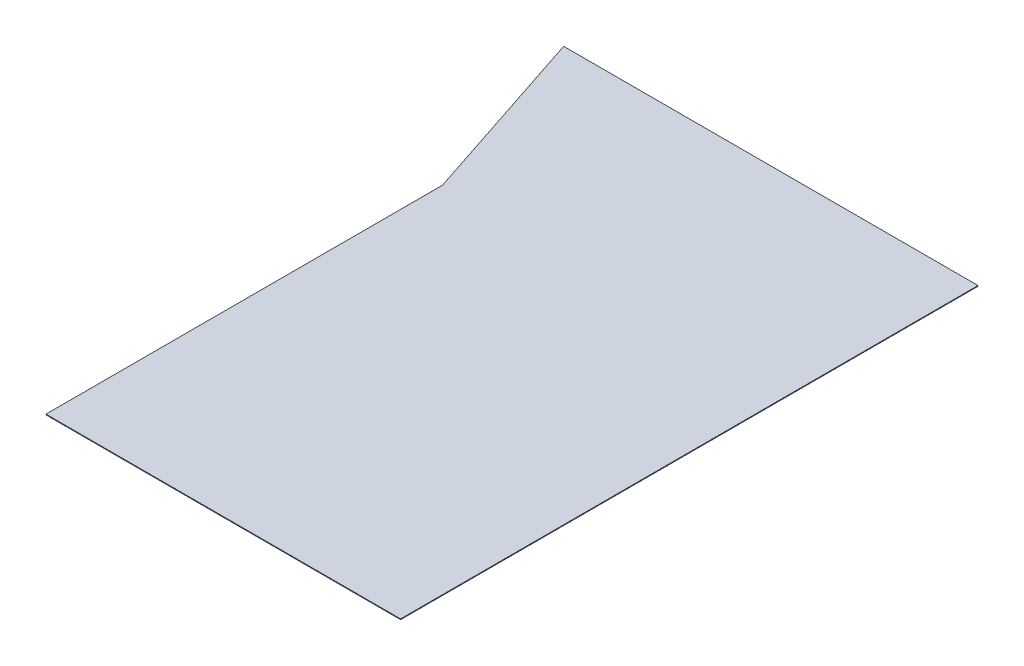
ISO-10303-21;
HEADER;
FILE_DESCRIPTION(('STEP AP214'),'2;1');
FILE_NAME('part.step','',(''),(''),'','','');
FILE_SCHEMA(('AUTOMOTIVE_DESIGN { 1 0 10303 214 1 1 1 1 }'));
ENDSEC;
DATA;
#1=APPLICATION_CONTEXT('core data for automotive mechanical design processes');
#2=APPLICATION_PROTOCOL_DEFINITION('international standard','automotive_design',2000,#1);
#3=PRODUCT_CONTEXT('',#1,'mechanical');
#4=PRODUCT('Part','Part','',(#3));
#5=PRODUCT_RELATED_PRODUCT_CATEGORY('part','',(#4));
#6=PRODUCT_DEFINITION_FORMATION('','',#4);
#7=PRODUCT_DEFINITION_CONTEXT('part definition',#1,'design');
#8=PRODUCT_DEFINITION('design','',#6,#7);
#9=PRODUCT_DEFINITION_SHAPE('','',#8);
#10=(LENGTH_UNIT() NAMED_UNIT(*) SI_UNIT(.MILLI.,.METRE.));
#11=(NAMED_UNIT(*) PLANE_ANGLE_UNIT() SI_UNIT($,.RADIAN.));
#12=(NAMED_UNIT(*) SI_UNIT($,.STERADIAN.) SOLID_ANGLE_UNIT());
#13=UNCERTAINTY_MEASURE_WITH_UNIT(LENGTH_MEASURE(1.E-05),#10,'distance_accuracy_value','');
#14=(GEOMETRIC_REPRESENTATION_CONTEXT(3) GLOBAL_UNCERTAINTY_ASSIGNED_CONTEXT((#13)) GLOBAL_UNIT_ASSIGNED_CONTEXT((#10,
#11,#12)) REPRESENTATION_CONTEXT('',''));
#15=CARTESIAN_POINT('',(0.,0.,0.));
#16=DIRECTION('',(0.,0.,1.));
#17=DIRECTION('',(1.,0.,0.));
#18=AXIS2_PLACEMENT_3D('',#15,#16,#17);
#19=CARTESIAN_POINT('',(-232.5,-0.8,-324.));
#20=DIRECTION('',(0.,0.,-1.));
#21=DIRECTION('',(-1.,0.,0.));
#22=AXIS2_PLACEMENT_3D('',#19,#20,#21);
#23=PLANE('',#22);
#24=DIRECTION('',(-1.,0.,0.));
#25=VECTOR('',#24,1.);
#26=CARTESIAN_POINT('',(-232.5,0.,-324.));
#27=LINE('',#26,#25);
#28=CARTESIAN_POINT('',(232.5,0.,-324.));
#29=VERTEX_POINT('',#28);
#30=CARTESIAN_POINT('',(-232.5,0.,-324.));
#31=VERTEX_POINT('',#30);
#32=EDGE_CURVE('E110',#29,#31,#27,.T.);
#33=ORIENTED_EDGE('',*,*,#32,.F.);
#34=DIRECTION('',(0.,1.,0.));
#35=VECTOR('',#34,1.);
#36=CARTESIAN_POINT('',(232.5,-0.8,-324.));
#37=LINE('',#36,#35);
#38=CARTESIAN_POINT('',(232.5,-0.8,-324.));
#39=VERTEX_POINT('',#38);
#40=EDGE_CURVE('E11',#39,#29,#37,.T.);
#41=ORIENTED_EDGE('',*,*,#40,.F.);
#42=DIRECTION('',(-1.,0.,0.));
#43=VECTOR('',#42,1.);
#44=CARTESIAN_POINT('',(-232.5,-0.8,-324.));
#45=LINE('',#44,#43);
#46=CARTESIAN_POINT('',(-232.5,-0.8,-324.));
#47=VERTEX_POINT('',#46);
#48=EDGE_CURVE('E105',#39,#47,#45,.T.);
#49=ORIENTED_EDGE('',*,*,#48,.T.);
#50=DIRECTION('',(0.,1.,0.));
#51=VECTOR('',#50,1.);
#52=CARTESIAN_POINT('',(-232.5,-0.8,-324.));
#53=LINE('',#52,#51);
#54=EDGE_CURVE('E36',#47,#31,#53,.T.);
#55=ORIENTED_EDGE('',*,*,#54,.T.);
#56=EDGE_LOOP('',(#33,#41,#49,#55));
#57=FACE_BOUND('',#56,.T.);
#58=ADVANCED_FACE('F33',(#57),#23,.T.);
#59=CARTESIAN_POINT('',(232.5,-0.8,-324.));
#60=DIRECTION('',(1.,0.,0.));
#61=DIRECTION('',(0.,0.,-1.));
#62=AXIS2_PLACEMENT_3D('',#59,#60,#61);
#63=PLANE('',#62);
#64=DIRECTION('',(0.,0.,-1.));
#65=VECTOR('',#64,1.);
#66=CARTESIAN_POINT('',(232.5,0.,-324.));
#67=LINE('',#66,#65);
#68=CARTESIAN_POINT('',(232.5,0.,324.));
#69=VERTEX_POINT('',#68);
#70=EDGE_CURVE('E67',#69,#29,#67,.T.);
#71=ORIENTED_EDGE('',*,*,#70,.F.);
#72=DIRECTION('',(0.,1.,0.));
#73=VECTOR('',#72,1.);
#74=CARTESIAN_POINT('',(232.5,-0.8,324.));
#75=LINE('',#74,#73);
#76=CARTESIAN_POINT('',(232.5,-0.8,324.));
#77=VERTEX_POINT('',#76);
#78=EDGE_CURVE('E42',#77,#69,#75,.T.);
#79=ORIENTED_EDGE('',*,*,#78,.F.);
#80=DIRECTION('',(0.,0.,-1.));
#81=VECTOR('',#80,1.);
#82=CARTESIAN_POINT('',(232.5,-0.8,324.));
#83=LINE('',#82,#81);
#84=EDGE_CURVE('E50',#77,#39,#83,.T.);
#85=ORIENTED_EDGE('',*,*,#84,.T.);
#86=ORIENTED_EDGE('',*,*,#40,.T.);
#87=EDGE_LOOP('',(#71,#79,#85,#86));
#88=FACE_BOUND('',#87,.T.);
#89=ADVANCED_FACE('F133',(#88),#63,.T.);
#90=CARTESIAN_POINT('',(232.5,-0.8,324.));
#91=DIRECTION('',(0.,0.,1.));
#92=DIRECTION('',(1.,0.,0.));
#93=AXIS2_PLACEMENT_3D('',#90,#91,#92);
#94=PLANE('',#93);
#95=DIRECTION('',(1.,0.,0.));
#96=VECTOR('',#95,1.);
#97=CARTESIAN_POINT('',(232.5,0.,324.));
#98=LINE('',#97,#96);
#99=CARTESIAN_POINT('',(-165.5,0.,324.));
#100=VERTEX_POINT('',#99);
#101=EDGE_CURVE('E89',#100,#69,#98,.T.);
#102=ORIENTED_EDGE('',*,*,#101,.F.);
#103=DIRECTION('',(0.,1.,0.));
#104=VECTOR('',#103,1.);
#105=CARTESIAN_POINT('',(-165.5,-0.8,324.));
#106=LINE('',#105,#104);
#107=CARTESIAN_POINT('',(-165.5,-0.8,324.));
#108=VERTEX_POINT('',#107);
#109=EDGE_CURVE('E84',#108,#100,#106,.T.);
#110=ORIENTED_EDGE('',*,*,#109,.F.);
#111=DIRECTION('',(1.,0.,0.));
#112=VECTOR('',#111,1.);
#113=CARTESIAN_POINT('',(232.5,-0.8,324.));
#114=LINE('',#113,#112);
#115=EDGE_CURVE('E87',#108,#77,#114,.T.);
#116=ORIENTED_EDGE('',*,*,#115,.T.);
#117=ORIENTED_EDGE('',*,*,#78,.T.);
#118=EDGE_LOOP('',(#102,#110,#116,#117));
#119=FACE_BOUND('',#118,.T.);
#120=ADVANCED_FACE('F86',(#119),#94,.T.);
#121=CARTESIAN_POINT('',(-165.5,-0.8,324.));
#122=DIRECTION('',(-1.,0.,0.));
#123=DIRECTION('',(0.,0.,1.));
#124=AXIS2_PLACEMENT_3D('',#121,#122,#123);
#125=PLANE('',#124);
#126=DIRECTION('',(0.,0.,1.));
#127=VECTOR('',#126,1.);
#128=CARTESIAN_POINT('',(-165.5,0.,324.));
#129=LINE('',#128,#127);
#130=CARTESIAN_POINT('',(-165.5,0.,-121.));
#131=VERTEX_POINT('',#130);
#132=EDGE_CURVE('E116',#131,#100,#129,.T.);
#133=ORIENTED_EDGE('',*,*,#132,.F.);
#134=DIRECTION('',(0.,1.,0.));
#135=VECTOR('',#134,1.);
#136=CARTESIAN_POINT('',(-165.5,-0.8,-121.));
#137=LINE('',#136,#135);
#138=CARTESIAN_POINT('',(-165.5,-0.8,-121.));
#139=VERTEX_POINT('',#138);
#140=EDGE_CURVE('E94',#139,#131,#137,.T.);
#141=ORIENTED_EDGE('',*,*,#140,.F.);
#142=DIRECTION('',(0.,0.,1.));
#143=VECTOR('',#142,1.);
#144=CARTESIAN_POINT('',(-165.5,-0.8,324.));
#145=LINE('',#144,#143);
#146=EDGE_CURVE('E100',#139,#108,#145,.T.);
#147=ORIENTED_EDGE('',*,*,#146,.T.);
#148=ORIENTED_EDGE('',*,*,#109,.T.);
#149=EDGE_LOOP('',(#133,#141,#147,#148));
#150=FACE_BOUND('',#149,.T.);
#151=ADVANCED_FACE('F102',(#150),#125,.T.);
#152=CARTESIAN_POINT('',(-232.5,-0.8,-324.));
#153=DIRECTION('',(-0.949614727084766,0.,0.313419638988568));
#154=DIRECTION('',(0.313419638988568,0.,0.949614727084767));
#155=AXIS2_PLACEMENT_3D('',#152,#153,#154);
#156=PLANE('',#155);
#157=DIRECTION('',(0.313419638988568,0.,0.949614727084766));
#158=VECTOR('',#157,1.);
#159=CARTESIAN_POINT('',(-232.5,0.,-324.));
#160=LINE('',#159,#158);
#161=EDGE_CURVE('E113',#31,#131,#160,.T.);
#162=ORIENTED_EDGE('',*,*,#161,.F.);
#163=ORIENTED_EDGE('',*,*,#54,.F.);
#164=DIRECTION('',(0.313419638988568,0.,0.949614727084766));
#165=VECTOR('',#164,1.);
#166=CARTESIAN_POINT('',(-232.5,-0.8,-324.));
#167=LINE('',#166,#165);
#168=EDGE_CURVE('E103',#47,#139,#167,.T.);
#169=ORIENTED_EDGE('',*,*,#168,.T.);
#170=ORIENTED_EDGE('',*,*,#140,.T.);
#171=EDGE_LOOP('',(#162,#163,#169,#170));
#172=FACE_BOUND('',#171,.T.);
#173=ADVANCED_FACE('F122',(#172),#156,.T.);
#174=CARTESIAN_POINT('',(232.5,-0.8,-324.));
#175=DIRECTION('',(0.,-1.,0.));
#176=DIRECTION('',(0.,0.,-1.));
#177=AXIS2_PLACEMENT_3D('',#174,#175,#176);
#178=PLANE('',#177);
#179=ORIENTED_EDGE('',*,*,#48,.F.);
#180=ORIENTED_EDGE('',*,*,#84,.F.);
#181=ORIENTED_EDGE('',*,*,#115,.F.);
#182=ORIENTED_EDGE('',*,*,#146,.F.);
#183=ORIENTED_EDGE('',*,*,#168,.F.);
#184=EDGE_LOOP('',(#179,#180,#181,#182,#183));
#185=FACE_BOUND('',#184,.T.);
#186=ADVANCED_FACE('F99',(#185),#178,.T.);
#187=CARTESIAN_POINT('',(232.5,0.,-324.));
#188=DIRECTION('',(0.,-1.,0.));
#189=DIRECTION('',(0.,0.,-1.));
#190=AXIS2_PLACEMENT_3D('',#187,#188,#189);
#191=PLANE('',#190);
#192=ORIENTED_EDGE('',*,*,#32,.T.);
#193=ORIENTED_EDGE('',*,*,#161,.T.);
#194=ORIENTED_EDGE('',*,*,#132,.T.);
#195=ORIENTED_EDGE('',*,*,#101,.T.);
#196=ORIENTED_EDGE('',*,*,#70,.T.);
#197=EDGE_LOOP('',(#192,#193,#194,#195,#196));
#198=FACE_BOUND('',#197,.T.);
#199=ADVANCED_FACE('F124',(#198),#191,.F.);
#200=CLOSED_SHELL('',(#58,#89,#120,#151,#173,#186,#199));
#201=MANIFOLD_SOLID_BREP('B2',#200);
#202=ADVANCED_BREP_SHAPE_REPRESENTATION('',(#18,#201),#14);
#203=SHAPE_DEFINITION_REPRESENTATION(#9,#202);
ENDSEC;
END-ISO-10303-21;
